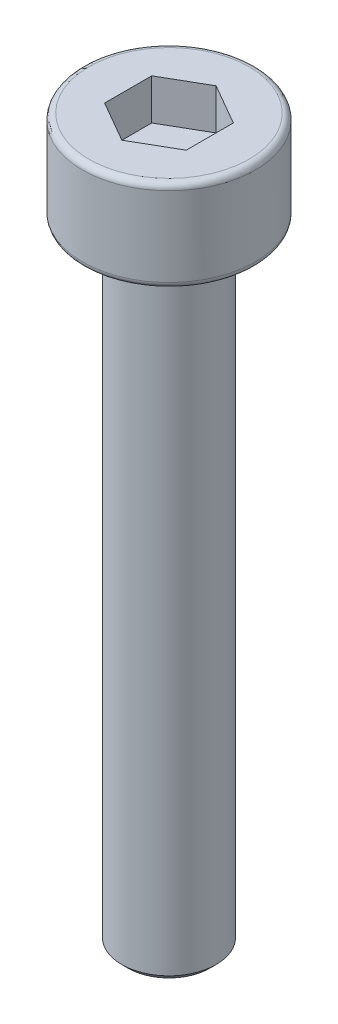
ISO-10303-21;
HEADER;
FILE_DESCRIPTION(('STEP AP214'),'2;1');
FILE_NAME('part.step','',(''),(''),'','','');
FILE_SCHEMA(('AUTOMOTIVE_DESIGN { 1 0 10303 214 1 1 1 1 }'));
ENDSEC;
DATA;
#1=APPLICATION_CONTEXT('core data for automotive mechanical design processes');
#2=APPLICATION_PROTOCOL_DEFINITION('international standard','automotive_design',2000,#1);
#3=PRODUCT_CONTEXT('',#1,'mechanical');
#4=PRODUCT('Part','Part','',(#3));
#5=PRODUCT_RELATED_PRODUCT_CATEGORY('part','',(#4));
#6=PRODUCT_DEFINITION_FORMATION('','',#4);
#7=PRODUCT_DEFINITION_CONTEXT('part definition',#1,'design');
#8=PRODUCT_DEFINITION('design','',#6,#7);
#9=PRODUCT_DEFINITION_SHAPE('','',#8);
#10=(LENGTH_UNIT() NAMED_UNIT(*) SI_UNIT(.MILLI.,.METRE.));
#11=(NAMED_UNIT(*) PLANE_ANGLE_UNIT() SI_UNIT($,.RADIAN.));
#12=(NAMED_UNIT(*) SI_UNIT($,.STERADIAN.) SOLID_ANGLE_UNIT());
#13=UNCERTAINTY_MEASURE_WITH_UNIT(LENGTH_MEASURE(1.E-05),#10,'distance_accuracy_value','');
#14=(GEOMETRIC_REPRESENTATION_CONTEXT(3) GLOBAL_UNCERTAINTY_ASSIGNED_CONTEXT((#13)) GLOBAL_UNIT_ASSIGNED_CONTEXT((#10,
#11,#12)) REPRESENTATION_CONTEXT('',''));
#15=CARTESIAN_POINT('',(0.,0.,0.));
#16=DIRECTION('',(0.,0.,1.));
#17=DIRECTION('',(1.,0.,0.));
#18=AXIS2_PLACEMENT_3D('',#15,#16,#17);
#19=CARTESIAN_POINT('',(0.,0.,0.));
#20=DIRECTION('',(0.,-1.,0.));
#21=DIRECTION('',(0.,0.,-1.));
#22=AXIS2_PLACEMENT_3D('',#19,#20,#21);
#23=PLANE('',#22);
#24=CARTESIAN_POINT('',(0.,0.,0.));
#25=DIRECTION('',(0.,-1.,0.));
#26=DIRECTION('',(0.,0.,-1.));
#27=AXIS2_PLACEMENT_3D('',#24,#25,#26);
#28=CIRCLE('',#27,2.55);
#29=CARTESIAN_POINT('',(0.,0.,-2.55));
#30=VERTEX_POINT('',#29);
#31=EDGE_CURVE('E151',#30,#30,#28,.F.);
#32=ORIENTED_EDGE('',*,*,#31,.T.);
#33=EDGE_LOOP('',(#32));
#34=FACE_BOUND('',#33,.T.);
#35=DIRECTION('',(-0.866025403784438,0.,0.5));
#36=VECTOR('',#35,1.);
#37=CARTESIAN_POINT('',(0.,0.,-1.5));
#38=LINE('',#37,#36);
#39=CARTESIAN_POINT('',(0.,0.,-1.5));
#40=VERTEX_POINT('',#39);
#41=CARTESIAN_POINT('',(-1.29903810567666,0.,-0.75));
#42=VERTEX_POINT('',#41);
#43=EDGE_CURVE('E130',#40,#42,#38,.T.);
#44=ORIENTED_EDGE('',*,*,#43,.F.);
#45=DIRECTION('',(-0.866025403784439,0.,-0.5));
#46=VECTOR('',#45,1.);
#47=CARTESIAN_POINT('',(1.29903810567666,0.,-0.750000000000001));
#48=LINE('',#47,#46);
#49=CARTESIAN_POINT('',(1.29903810567666,0.,-0.750000000000001));
#50=VERTEX_POINT('',#49);
#51=EDGE_CURVE('E56',#50,#40,#48,.T.);
#52=ORIENTED_EDGE('',*,*,#51,.F.);
#53=DIRECTION('',(0.,0.,-1.));
#54=VECTOR('',#53,1.);
#55=CARTESIAN_POINT('',(1.29903810567666,0.,0.75));
#56=LINE('',#55,#54);
#57=CARTESIAN_POINT('',(1.29903810567666,0.,0.75));
#58=VERTEX_POINT('',#57);
#59=EDGE_CURVE('E139',#58,#50,#56,.T.);
#60=ORIENTED_EDGE('',*,*,#59,.F.);
#61=DIRECTION('',(0.866025403784439,0.,-0.5));
#62=VECTOR('',#61,1.);
#63=CARTESIAN_POINT('',(0.,0.,1.5));
#64=LINE('',#63,#62);
#65=CARTESIAN_POINT('',(0.,0.,1.5));
#66=VERTEX_POINT('',#65);
#67=EDGE_CURVE('E137',#66,#58,#64,.T.);
#68=ORIENTED_EDGE('',*,*,#67,.F.);
#69=DIRECTION('',(0.866025403784439,0.,0.5));
#70=VECTOR('',#69,1.);
#71=CARTESIAN_POINT('',(-1.29903810567666,0.,0.75));
#72=LINE('',#71,#70);
#73=CARTESIAN_POINT('',(-1.29903810567666,0.,0.75));
#74=VERTEX_POINT('',#73);
#75=EDGE_CURVE('E104',#74,#66,#72,.T.);
#76=ORIENTED_EDGE('',*,*,#75,.F.);
#77=DIRECTION('',(0.,0.,1.));
#78=VECTOR('',#77,1.);
#79=CARTESIAN_POINT('',(-1.29903810567666,0.,-0.75));
#80=LINE('',#79,#78);
#81=EDGE_CURVE('E133',#42,#74,#80,.T.);
#82=ORIENTED_EDGE('',*,*,#81,.F.);
#83=EDGE_LOOP('',(#44,#52,#60,#68,#76,#82));
#84=FACE_BOUND('',#83,.T.);
#85=ADVANCED_FACE('F41',(#34,#84),#23,.F.);
#86=CARTESIAN_POINT('',(0.,0.,0.));
#87=DIRECTION('',(0.,1.,0.));
#88=DIRECTION('',(0.,0.,1.));
#89=AXIS2_PLACEMENT_3D('',#86,#87,#88);
#90=CYLINDRICAL_SURFACE('',#89,2.75);
#91=CARTESIAN_POINT('',(0.,-0.2,0.));
#92=DIRECTION('',(0.,-1.,0.));
#93=DIRECTION('',(0.,0.,-1.));
#94=AXIS2_PLACEMENT_3D('',#91,#92,#93);
#95=CIRCLE('',#94,2.75);
#96=CARTESIAN_POINT('',(0.,-0.2,-2.75));
#97=VERTEX_POINT('',#96);
#98=EDGE_CURVE('E157',#97,#97,#95,.T.);
#99=ORIENTED_EDGE('',*,*,#98,.T.);
#100=EDGE_LOOP('',(#99));
#101=FACE_BOUND('',#100,.T.);
#102=CARTESIAN_POINT('',(0.,-2.73,0.));
#103=DIRECTION('',(0.,1.,0.));
#104=DIRECTION('',(0.,0.,1.));
#105=AXIS2_PLACEMENT_3D('',#102,#103,#104);
#106=CIRCLE('',#105,2.75);
#107=CARTESIAN_POINT('',(0.,-2.73,2.75));
#108=VERTEX_POINT('',#107);
#109=EDGE_CURVE('E154',#108,#108,#106,.T.);
#110=ORIENTED_EDGE('',*,*,#109,.T.);
#111=EDGE_LOOP('',(#110));
#112=FACE_BOUND('',#111,.T.);
#113=ADVANCED_FACE('F179',(#101,#112),#90,.T.);
#114=CARTESIAN_POINT('',(2.75,-2.93,0.));
#115=DIRECTION('',(0.,1.,0.));
#116=DIRECTION('',(0.,0.,1.));
#117=AXIS2_PLACEMENT_3D('',#114,#115,#116);
#118=PLANE('',#117);
#119=CARTESIAN_POINT('',(0.,-2.93,0.));
#120=DIRECTION('',(0.,1.,0.));
#121=DIRECTION('',(0.,0.,1.));
#122=AXIS2_PLACEMENT_3D('',#119,#120,#121);
#123=CIRCLE('',#122,2.55);
#124=CARTESIAN_POINT('',(0.,-2.93,2.55));
#125=VERTEX_POINT('',#124);
#126=EDGE_CURVE('E160',#125,#125,#123,.F.);
#127=ORIENTED_EDGE('',*,*,#126,.T.);
#128=EDGE_LOOP('',(#127));
#129=FACE_BOUND('',#128,.T.);
#130=CARTESIAN_POINT('',(0.,-2.93,0.));
#131=DIRECTION('',(0.,1.,0.));
#132=DIRECTION('',(0.,0.,1.));
#133=AXIS2_PLACEMENT_3D('',#130,#131,#132);
#134=CIRCLE('',#133,1.5);
#135=CARTESIAN_POINT('',(0.,-2.93,1.5));
#136=VERTEX_POINT('',#135);
#137=EDGE_CURVE('E143',#136,#136,#134,.T.);
#138=ORIENTED_EDGE('',*,*,#137,.T.);
#139=EDGE_LOOP('',(#138));
#140=FACE_BOUND('',#139,.T.);
#141=ADVANCED_FACE('F186',(#129,#140),#118,.F.);
#142=CARTESIAN_POINT('',(0.,0.,0.));
#143=DIRECTION('',(0.,1.,0.));
#144=DIRECTION('',(0.,0.,1.));
#145=AXIS2_PLACEMENT_3D('',#142,#143,#144);
#146=CYLINDRICAL_SURFACE('',#145,1.5);
#147=CARTESIAN_POINT('',(0.,-22.73,0.));
#148=DIRECTION('',(0.,1.,0.));
#149=DIRECTION('',(0.,0.,1.));
#150=AXIS2_PLACEMENT_3D('',#147,#148,#149);
#151=CIRCLE('',#150,1.5);
#152=CARTESIAN_POINT('',(0.,-22.73,1.5));
#153=VERTEX_POINT('',#152);
#154=EDGE_CURVE('E49',#153,#153,#151,.T.);
#155=ORIENTED_EDGE('',*,*,#154,.T.);
#156=EDGE_LOOP('',(#155));
#157=FACE_BOUND('',#156,.T.);
#158=ORIENTED_EDGE('',*,*,#137,.F.);
#159=EDGE_LOOP('',(#158));
#160=FACE_BOUND('',#159,.T.);
#161=ADVANCED_FACE('F165',(#157,#160),#146,.T.);
#162=CARTESIAN_POINT('',(1.5,-22.93,0.));
#163=DIRECTION('',(0.,1.,0.));
#164=DIRECTION('',(0.,0.,1.));
#165=AXIS2_PLACEMENT_3D('',#162,#163,#164);
#166=PLANE('',#165);
#167=CARTESIAN_POINT('',(0.,-22.93,0.));
#168=DIRECTION('',(0.,1.,0.));
#169=DIRECTION('',(0.,0.,1.));
#170=AXIS2_PLACEMENT_3D('',#167,#168,#169);
#171=CIRCLE('',#170,1.3);
#172=CARTESIAN_POINT('',(0.,-22.93,1.3));
#173=VERTEX_POINT('',#172);
#174=EDGE_CURVE('E11',#173,#173,#171,.F.);
#175=ORIENTED_EDGE('',*,*,#174,.T.);
#176=EDGE_LOOP('',(#175));
#177=FACE_BOUND('',#176,.T.);
#178=ADVANCED_FACE('F225',(#177),#166,.F.);
#179=CARTESIAN_POINT('',(1.29903810567666,-1.3,-0.750000000000001));
#180=DIRECTION('',(0.5,0.,-0.866025403784439));
#181=DIRECTION('',(-0.866025403784439,0.,-0.5));
#182=AXIS2_PLACEMENT_3D('',#179,#180,#181);
#183=PLANE('',#182);
#184=ORIENTED_EDGE('',*,*,#51,.T.);
#185=DIRECTION('',(0.,1.,0.));
#186=VECTOR('',#185,1.);
#187=CARTESIAN_POINT('',(0.,-1.3,-1.5));
#188=LINE('',#187,#186);
#189=CARTESIAN_POINT('',(0.,-1.3,-1.5));
#190=VERTEX_POINT('',#189);
#191=EDGE_CURVE('E86',#190,#40,#188,.T.);
#192=ORIENTED_EDGE('',*,*,#191,.F.);
#193=DIRECTION('',(-0.866025403784439,0.,-0.5));
#194=VECTOR('',#193,1.);
#195=CARTESIAN_POINT('',(1.29903810567666,-1.3,-0.750000000000001));
#196=LINE('',#195,#194);
#197=CARTESIAN_POINT('',(1.29903810567666,-1.3,-0.750000000000001));
#198=VERTEX_POINT('',#197);
#199=EDGE_CURVE('E141',#198,#190,#196,.T.);
#200=ORIENTED_EDGE('',*,*,#199,.F.);
#201=DIRECTION('',(0.,1.,0.));
#202=VECTOR('',#201,1.);
#203=CARTESIAN_POINT('',(1.29903810567666,-1.3,-0.750000000000001));
#204=LINE('',#203,#202);
#205=EDGE_CURVE('E64',#198,#50,#204,.T.);
#206=ORIENTED_EDGE('',*,*,#205,.T.);
#207=EDGE_LOOP('',(#184,#192,#200,#206));
#208=FACE_BOUND('',#207,.T.);
#209=ADVANCED_FACE('F215',(#208),#183,.F.);
#210=CARTESIAN_POINT('',(1.29903810567666,-1.3,0.75));
#211=DIRECTION('',(1.,0.,0.));
#212=DIRECTION('',(0.,0.,-1.));
#213=AXIS2_PLACEMENT_3D('',#210,#211,#212);
#214=PLANE('',#213);
#215=ORIENTED_EDGE('',*,*,#59,.T.);
#216=ORIENTED_EDGE('',*,*,#205,.F.);
#217=DIRECTION('',(0.,0.,-1.));
#218=VECTOR('',#217,1.);
#219=CARTESIAN_POINT('',(1.29903810567666,-1.3,0.75));
#220=LINE('',#219,#218);
#221=CARTESIAN_POINT('',(1.29903810567666,-1.3,0.75));
#222=VERTEX_POINT('',#221);
#223=EDGE_CURVE('E116',#222,#198,#220,.T.);
#224=ORIENTED_EDGE('',*,*,#223,.F.);
#225=DIRECTION('',(0.,1.,0.));
#226=VECTOR('',#225,1.);
#227=CARTESIAN_POINT('',(1.29903810567666,-1.3,0.75));
#228=LINE('',#227,#226);
#229=EDGE_CURVE('E108',#222,#58,#228,.T.);
#230=ORIENTED_EDGE('',*,*,#229,.T.);
#231=EDGE_LOOP('',(#215,#216,#224,#230));
#232=FACE_BOUND('',#231,.T.);
#233=ADVANCED_FACE('F212',(#232),#214,.F.);
#234=CARTESIAN_POINT('',(0.,-1.3,1.5));
#235=DIRECTION('',(0.5,0.,0.866025403784439));
#236=DIRECTION('',(0.866025403784439,0.,-0.5));
#237=AXIS2_PLACEMENT_3D('',#234,#235,#236);
#238=PLANE('',#237);
#239=ORIENTED_EDGE('',*,*,#67,.T.);
#240=ORIENTED_EDGE('',*,*,#229,.F.);
#241=DIRECTION('',(0.866025403784439,0.,-0.5));
#242=VECTOR('',#241,1.);
#243=CARTESIAN_POINT('',(0.,-1.3,1.5));
#244=LINE('',#243,#242);
#245=CARTESIAN_POINT('',(0.,-1.3,1.5));
#246=VERTEX_POINT('',#245);
#247=EDGE_CURVE('E112',#246,#222,#244,.T.);
#248=ORIENTED_EDGE('',*,*,#247,.F.);
#249=DIRECTION('',(0.,1.,0.));
#250=VECTOR('',#249,1.);
#251=CARTESIAN_POINT('',(0.,-1.3,1.5));
#252=LINE('',#251,#250);
#253=EDGE_CURVE('E97',#246,#66,#252,.T.);
#254=ORIENTED_EDGE('',*,*,#253,.T.);
#255=EDGE_LOOP('',(#239,#240,#248,#254));
#256=FACE_BOUND('',#255,.T.);
#257=ADVANCED_FACE('F113',(#256),#238,.F.);
#258=CARTESIAN_POINT('',(-1.29903810567666,-1.3,0.75));
#259=DIRECTION('',(-0.5,0.,0.866025403784439));
#260=DIRECTION('',(0.866025403784439,0.,0.5));
#261=AXIS2_PLACEMENT_3D('',#258,#259,#260);
#262=PLANE('',#261);
#263=ORIENTED_EDGE('',*,*,#75,.T.);
#264=ORIENTED_EDGE('',*,*,#253,.F.);
#265=DIRECTION('',(0.866025403784439,0.,0.5));
#266=VECTOR('',#265,1.);
#267=CARTESIAN_POINT('',(-1.29903810567666,-1.3,0.75));
#268=LINE('',#267,#266);
#269=CARTESIAN_POINT('',(-1.29903810567666,-1.3,0.75));
#270=VERTEX_POINT('',#269);
#271=EDGE_CURVE('E101',#270,#246,#268,.T.);
#272=ORIENTED_EDGE('',*,*,#271,.F.);
#273=DIRECTION('',(0.,1.,0.));
#274=VECTOR('',#273,1.);
#275=CARTESIAN_POINT('',(-1.29903810567666,-1.3,0.75));
#276=LINE('',#275,#274);
#277=EDGE_CURVE('E109',#270,#74,#276,.T.);
#278=ORIENTED_EDGE('',*,*,#277,.T.);
#279=EDGE_LOOP('',(#263,#264,#272,#278));
#280=FACE_BOUND('',#279,.T.);
#281=ADVANCED_FACE('F99',(#280),#262,.F.);
#282=CARTESIAN_POINT('',(-1.29903810567666,-1.3,-0.75));
#283=DIRECTION('',(-1.,0.,0.));
#284=DIRECTION('',(0.,0.,1.));
#285=AXIS2_PLACEMENT_3D('',#282,#283,#284);
#286=PLANE('',#285);
#287=ORIENTED_EDGE('',*,*,#81,.T.);
#288=ORIENTED_EDGE('',*,*,#277,.F.);
#289=DIRECTION('',(0.,0.,1.));
#290=VECTOR('',#289,1.);
#291=CARTESIAN_POINT('',(-1.29903810567666,-1.3,-0.75));
#292=LINE('',#291,#290);
#293=CARTESIAN_POINT('',(-1.29903810567666,-1.3,-0.75));
#294=VERTEX_POINT('',#293);
#295=EDGE_CURVE('E122',#294,#270,#292,.T.);
#296=ORIENTED_EDGE('',*,*,#295,.F.);
#297=DIRECTION('',(0.,1.,0.));
#298=VECTOR('',#297,1.);
#299=CARTESIAN_POINT('',(-1.29903810567666,-1.3,-0.75));
#300=LINE('',#299,#298);
#301=EDGE_CURVE('E146',#294,#42,#300,.T.);
#302=ORIENTED_EDGE('',*,*,#301,.T.);
#303=EDGE_LOOP('',(#287,#288,#296,#302));
#304=FACE_BOUND('',#303,.T.);
#305=ADVANCED_FACE('F208',(#304),#286,.F.);
#306=CARTESIAN_POINT('',(0.,-1.3,-1.5));
#307=DIRECTION('',(-0.5,0.,-0.866025403784438));
#308=DIRECTION('',(-0.866025403784439,0.,0.5));
#309=AXIS2_PLACEMENT_3D('',#306,#307,#308);
#310=PLANE('',#309);
#311=ORIENTED_EDGE('',*,*,#43,.T.);
#312=ORIENTED_EDGE('',*,*,#301,.F.);
#313=DIRECTION('',(-0.866025403784438,0.,0.5));
#314=VECTOR('',#313,1.);
#315=CARTESIAN_POINT('',(0.,-1.3,-1.5));
#316=LINE('',#315,#314);
#317=EDGE_CURVE('E124',#190,#294,#316,.T.);
#318=ORIENTED_EDGE('',*,*,#317,.F.);
#319=ORIENTED_EDGE('',*,*,#191,.T.);
#320=EDGE_LOOP('',(#311,#312,#318,#319));
#321=FACE_BOUND('',#320,.T.);
#322=ADVANCED_FACE('F197',(#321),#310,.F.);
#323=CARTESIAN_POINT('',(0.,-1.3,0.));
#324=DIRECTION('',(0.,1.,0.));
#325=DIRECTION('',(0.,0.,1.));
#326=AXIS2_PLACEMENT_3D('',#323,#324,#325);
#327=PLANE('',#326);
#328=ORIENTED_EDGE('',*,*,#199,.T.);
#329=ORIENTED_EDGE('',*,*,#317,.T.);
#330=ORIENTED_EDGE('',*,*,#295,.T.);
#331=ORIENTED_EDGE('',*,*,#271,.T.);
#332=ORIENTED_EDGE('',*,*,#247,.T.);
#333=ORIENTED_EDGE('',*,*,#223,.T.);
#334=EDGE_LOOP('',(#328,#329,#330,#331,#332,#333));
#335=FACE_BOUND('',#334,.T.);
#336=ADVANCED_FACE('F119',(#335),#327,.T.);
#337=CARTESIAN_POINT('',(0.,-0.2,0.));
#338=DIRECTION('',(0.,-1.,0.));
#339=DIRECTION('',(0.,0.,-1.));
#340=AXIS2_PLACEMENT_3D('',#337,#338,#339);
#341=TOROIDAL_SURFACE('',#340,2.55,0.2);
#342=ORIENTED_EDGE('',*,*,#98,.F.);
#343=EDGE_LOOP('',(#342));
#344=FACE_BOUND('',#343,.T.);
#345=ORIENTED_EDGE('',*,*,#31,.F.);
#346=EDGE_LOOP('',(#345));
#347=FACE_BOUND('',#346,.T.);
#348=ADVANCED_FACE('F175',(#344,#347),#341,.T.);
#349=CARTESIAN_POINT('',(0.,-2.73,0.));
#350=DIRECTION('',(0.,1.,0.));
#351=DIRECTION('',(0.,0.,1.));
#352=AXIS2_PLACEMENT_3D('',#349,#350,#351);
#353=TOROIDAL_SURFACE('',#352,2.55,0.2);
#354=ORIENTED_EDGE('',*,*,#126,.F.);
#355=EDGE_LOOP('',(#354));
#356=FACE_BOUND('',#355,.T.);
#357=ORIENTED_EDGE('',*,*,#109,.F.);
#358=EDGE_LOOP('',(#357));
#359=FACE_BOUND('',#358,.T.);
#360=ADVANCED_FACE('F169',(#356,#359),#353,.T.);
#361=CARTESIAN_POINT('',(0.,-22.73,0.));
#362=DIRECTION('',(0.,1.,0.));
#363=DIRECTION('',(0.,0.,1.));
#364=AXIS2_PLACEMENT_3D('',#361,#362,#363);
#365=CONICAL_SURFACE('',#364,1.5,0.785398163397441);
#366=ORIENTED_EDGE('',*,*,#174,.F.);
#367=EDGE_LOOP('',(#366));
#368=FACE_BOUND('',#367,.T.);
#369=ORIENTED_EDGE('',*,*,#154,.F.);
#370=EDGE_LOOP('',(#369));
#371=FACE_BOUND('',#370,.T.);
#372=ADVANCED_FACE('F43',(#368,#371),#365,.T.);
#373=CLOSED_SHELL('',(#85,#113,#141,#161,#178,#209,#233,#257,#281,#305,#322,#336,#348,#360,#372));
#374=MANIFOLD_SOLID_BREP('B2',#373);
#375=ADVANCED_BREP_SHAPE_REPRESENTATION('',(#18,#374),#14);
#376=SHAPE_DEFINITION_REPRESENTATION(#9,#375);
ENDSEC;
END-ISO-10303-21;
